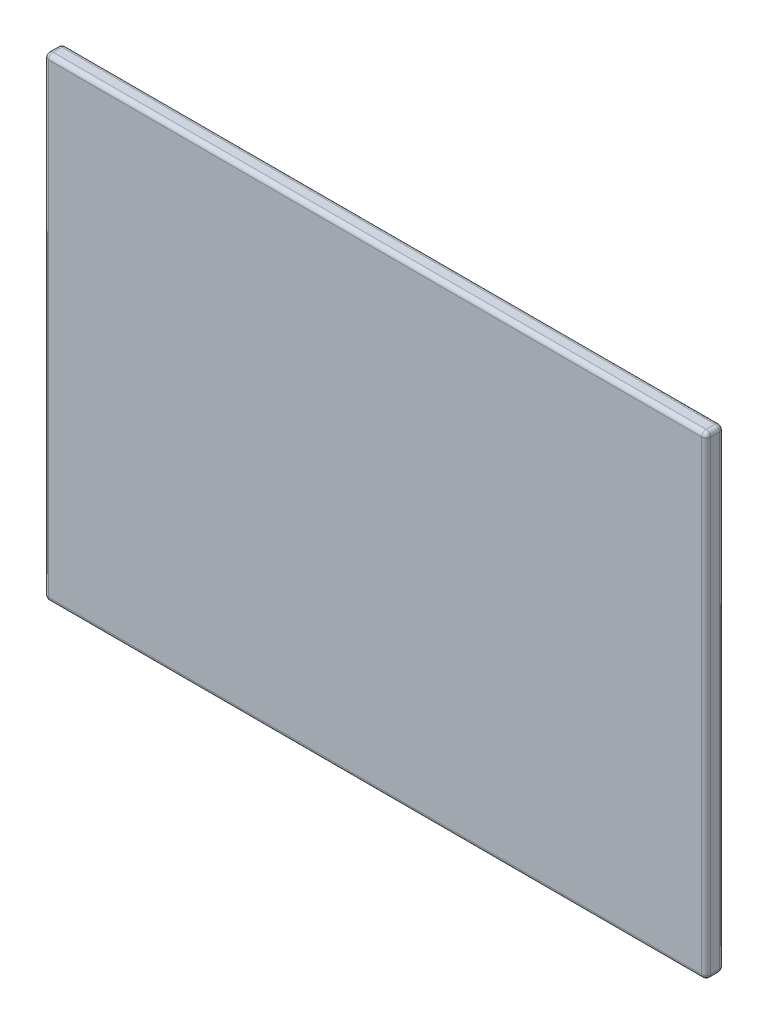
ISO-10303-21;
HEADER;
FILE_DESCRIPTION(('STEP AP214'),'2;1');
FILE_NAME('part.step','',(''),(''),'','','');
FILE_SCHEMA(('AUTOMOTIVE_DESIGN { 1 0 10303 214 1 1 1 1 }'));
ENDSEC;
DATA;
#1=APPLICATION_CONTEXT('core data for automotive mechanical design processes');
#2=APPLICATION_PROTOCOL_DEFINITION('international standard','automotive_design',2000,#1);
#3=PRODUCT_CONTEXT('',#1,'mechanical');
#4=PRODUCT('Part','Part','',(#3));
#5=PRODUCT_RELATED_PRODUCT_CATEGORY('part','',(#4));
#6=PRODUCT_DEFINITION_FORMATION('','',#4);
#7=PRODUCT_DEFINITION_CONTEXT('part definition',#1,'design');
#8=PRODUCT_DEFINITION('design','',#6,#7);
#9=PRODUCT_DEFINITION_SHAPE('','',#8);
#10=(LENGTH_UNIT() NAMED_UNIT(*) SI_UNIT(.MILLI.,.METRE.));
#11=(NAMED_UNIT(*) PLANE_ANGLE_UNIT() SI_UNIT($,.RADIAN.));
#12=(NAMED_UNIT(*) SI_UNIT($,.STERADIAN.) SOLID_ANGLE_UNIT());
#13=UNCERTAINTY_MEASURE_WITH_UNIT(LENGTH_MEASURE(1.E-05),#10,'distance_accuracy_value','');
#14=(GEOMETRIC_REPRESENTATION_CONTEXT(3) GLOBAL_UNCERTAINTY_ASSIGNED_CONTEXT((#13)) GLOBAL_UNIT_ASSIGNED_CONTEXT((#10,
#11,#12)) REPRESENTATION_CONTEXT('',''));
#15=CARTESIAN_POINT('',(0.,0.,0.));
#16=DIRECTION('',(0.,0.,1.));
#17=DIRECTION('',(1.,0.,0.));
#18=AXIS2_PLACEMENT_3D('',#15,#16,#17);
#19=CARTESIAN_POINT('',(37.35,-26.75,2.));
#20=DIRECTION('',(-1.,0.,0.));
#21=DIRECTION('',(0.,0.,1.));
#22=AXIS2_PLACEMENT_3D('',#19,#20,#21);
#23=PLANE('',#22);
#24=DIRECTION('',(0.,1.,0.));
#25=VECTOR('',#24,1.);
#26=CARTESIAN_POINT('',(37.35,-26.75,1.5));
#27=LINE('',#26,#25);
#28=CARTESIAN_POINT('',(37.35,26.25,1.5));
#29=VERTEX_POINT('',#28);
#30=CARTESIAN_POINT('',(37.35,-26.25,1.5));
#31=VERTEX_POINT('',#30);
#32=EDGE_CURVE('E42',#29,#31,#27,.F.);
#33=ORIENTED_EDGE('',*,*,#32,.T.);
#34=DIRECTION('',(0.,0.,-1.));
#35=VECTOR('',#34,1.);
#36=CARTESIAN_POINT('',(37.35,-26.25,2.));
#37=LINE('',#36,#35);
#38=CARTESIAN_POINT('',(37.35,-26.25,0.5));
#39=VERTEX_POINT('',#38);
#40=EDGE_CURVE('E11',#31,#39,#37,.T.);
#41=ORIENTED_EDGE('',*,*,#40,.T.);
#42=DIRECTION('',(0.,1.,0.));
#43=VECTOR('',#42,1.);
#44=CARTESIAN_POINT('',(37.35,26.75,0.5));
#45=LINE('',#44,#43);
#46=CARTESIAN_POINT('',(37.35,26.25,0.5));
#47=VERTEX_POINT('',#46);
#48=EDGE_CURVE('E194',#39,#47,#45,.T.);
#49=ORIENTED_EDGE('',*,*,#48,.T.);
#50=DIRECTION('',(0.,0.,-1.));
#51=VECTOR('',#50,1.);
#52=CARTESIAN_POINT('',(37.35,26.25,2.));
#53=LINE('',#52,#51);
#54=EDGE_CURVE('E53',#47,#29,#53,.F.);
#55=ORIENTED_EDGE('',*,*,#54,.T.);
#56=EDGE_LOOP('',(#33,#41,#49,#55));
#57=FACE_BOUND('',#56,.T.);
#58=ADVANCED_FACE('F33',(#57),#23,.F.);
#59=CARTESIAN_POINT('',(-37.35,26.75,2.));
#60=DIRECTION('',(0.,-1.,0.));
#61=DIRECTION('',(0.,0.,-1.));
#62=AXIS2_PLACEMENT_3D('',#59,#60,#61);
#63=PLANE('',#62);
#64=DIRECTION('',(0.,0.,-1.));
#65=VECTOR('',#64,1.);
#66=CARTESIAN_POINT('',(-36.85,26.75,2.));
#67=LINE('',#66,#65);
#68=CARTESIAN_POINT('',(-36.85,26.75,0.5));
#69=VERTEX_POINT('',#68);
#70=CARTESIAN_POINT('',(-36.85,26.75,1.5));
#71=VERTEX_POINT('',#70);
#72=EDGE_CURVE('E189',#69,#71,#67,.F.);
#73=ORIENTED_EDGE('',*,*,#72,.T.);
#74=DIRECTION('',(-1.,0.,0.));
#75=VECTOR('',#74,1.);
#76=CARTESIAN_POINT('',(-37.35,26.75,1.5));
#77=LINE('',#76,#75);
#78=CARTESIAN_POINT('',(36.85,26.75,1.5));
#79=VERTEX_POINT('',#78);
#80=EDGE_CURVE('E191',#71,#79,#77,.F.);
#81=ORIENTED_EDGE('',*,*,#80,.T.);
#82=DIRECTION('',(0.,0.,-1.));
#83=VECTOR('',#82,1.);
#84=CARTESIAN_POINT('',(36.85,26.75,2.));
#85=LINE('',#84,#83);
#86=CARTESIAN_POINT('',(36.85,26.75,0.5));
#87=VERTEX_POINT('',#86);
#88=EDGE_CURVE('E185',#79,#87,#85,.T.);
#89=ORIENTED_EDGE('',*,*,#88,.T.);
#90=DIRECTION('',(-1.,0.,0.));
#91=VECTOR('',#90,1.);
#92=CARTESIAN_POINT('',(-37.35,26.75,0.5));
#93=LINE('',#92,#91);
#94=EDGE_CURVE('E187',#87,#69,#93,.T.);
#95=ORIENTED_EDGE('',*,*,#94,.T.);
#96=EDGE_LOOP('',(#73,#81,#89,#95));
#97=FACE_BOUND('',#96,.T.);
#98=ADVANCED_FACE('F278',(#97),#63,.F.);
#99=CARTESIAN_POINT('',(-37.35,-26.75,2.));
#100=DIRECTION('',(1.,0.,0.));
#101=DIRECTION('',(0.,0.,-1.));
#102=AXIS2_PLACEMENT_3D('',#99,#100,#101);
#103=PLANE('',#102);
#104=DIRECTION('',(0.,0.,-1.));
#105=VECTOR('',#104,1.);
#106=CARTESIAN_POINT('',(-37.35,-26.25,2.));
#107=LINE('',#106,#105);
#108=CARTESIAN_POINT('',(-37.35,-26.25,0.5));
#109=VERTEX_POINT('',#108);
#110=CARTESIAN_POINT('',(-37.35,-26.25,1.5));
#111=VERTEX_POINT('',#110);
#112=EDGE_CURVE('E180',#109,#111,#107,.F.);
#113=ORIENTED_EDGE('',*,*,#112,.T.);
#114=DIRECTION('',(0.,-1.,0.));
#115=VECTOR('',#114,1.);
#116=CARTESIAN_POINT('',(-37.35,-26.75,1.5));
#117=LINE('',#116,#115);
#118=CARTESIAN_POINT('',(-37.35,26.25,1.5));
#119=VERTEX_POINT('',#118);
#120=EDGE_CURVE('E182',#111,#119,#117,.F.);
#121=ORIENTED_EDGE('',*,*,#120,.T.);
#122=DIRECTION('',(0.,0.,-1.));
#123=VECTOR('',#122,1.);
#124=CARTESIAN_POINT('',(-37.35,26.25,2.));
#125=LINE('',#124,#123);
#126=CARTESIAN_POINT('',(-37.35,26.25,0.5));
#127=VERTEX_POINT('',#126);
#128=EDGE_CURVE('E176',#119,#127,#125,.T.);
#129=ORIENTED_EDGE('',*,*,#128,.T.);
#130=DIRECTION('',(0.,-1.,0.));
#131=VECTOR('',#130,1.);
#132=CARTESIAN_POINT('',(-37.35,-26.75,0.5));
#133=LINE('',#132,#131);
#134=EDGE_CURVE('E178',#127,#109,#133,.T.);
#135=ORIENTED_EDGE('',*,*,#134,.T.);
#136=EDGE_LOOP('',(#113,#121,#129,#135));
#137=FACE_BOUND('',#136,.T.);
#138=ADVANCED_FACE('F269',(#137),#103,.F.);
#139=CARTESIAN_POINT('',(-37.35,-26.75,2.));
#140=DIRECTION('',(0.,1.,0.));
#141=DIRECTION('',(0.,0.,1.));
#142=AXIS2_PLACEMENT_3D('',#139,#140,#141);
#143=PLANE('',#142);
#144=DIRECTION('',(1.,0.,0.));
#145=VECTOR('',#144,1.);
#146=CARTESIAN_POINT('',(-37.35,-26.75,1.5));
#147=LINE('',#146,#145);
#148=CARTESIAN_POINT('',(36.85,-26.75,1.5));
#149=VERTEX_POINT('',#148);
#150=CARTESIAN_POINT('',(-36.85,-26.75,1.5));
#151=VERTEX_POINT('',#150);
#152=EDGE_CURVE('E129',#149,#151,#147,.F.);
#153=ORIENTED_EDGE('',*,*,#152,.T.);
#154=DIRECTION('',(0.,0.,-1.));
#155=VECTOR('',#154,1.);
#156=CARTESIAN_POINT('',(-36.85,-26.75,2.));
#157=LINE('',#156,#155);
#158=CARTESIAN_POINT('',(-36.85,-26.75,0.5));
#159=VERTEX_POINT('',#158);
#160=EDGE_CURVE('E165',#151,#159,#157,.T.);
#161=ORIENTED_EDGE('',*,*,#160,.T.);
#162=DIRECTION('',(1.,0.,0.));
#163=VECTOR('',#162,1.);
#164=CARTESIAN_POINT('',(37.35,-26.75,0.5));
#165=LINE('',#164,#163);
#166=CARTESIAN_POINT('',(36.85,-26.75,0.5));
#167=VERTEX_POINT('',#166);
#168=EDGE_CURVE('E158',#159,#167,#165,.T.);
#169=ORIENTED_EDGE('',*,*,#168,.T.);
#170=DIRECTION('',(0.,0.,-1.));
#171=VECTOR('',#170,1.);
#172=CARTESIAN_POINT('',(36.85,-26.75,2.));
#173=LINE('',#172,#171);
#174=EDGE_CURVE('E156',#167,#149,#173,.F.);
#175=ORIENTED_EDGE('',*,*,#174,.T.);
#176=EDGE_LOOP('',(#153,#161,#169,#175));
#177=FACE_BOUND('',#176,.T.);
#178=ADVANCED_FACE('F356',(#177),#143,.F.);
#179=CARTESIAN_POINT('',(0.,0.,2.));
#180=DIRECTION('',(0.,0.,-1.));
#181=DIRECTION('',(-1.,0.,0.));
#182=AXIS2_PLACEMENT_3D('',#179,#180,#181);
#183=PLANE('',#182);
#184=DIRECTION('',(0.,-1.,0.));
#185=VECTOR('',#184,1.);
#186=CARTESIAN_POINT('',(-36.85,0.,2.));
#187=LINE('',#186,#185);
#188=CARTESIAN_POINT('',(-36.85,26.25,2.));
#189=VERTEX_POINT('',#188);
#190=CARTESIAN_POINT('',(-36.85,-26.25,2.));
#191=VERTEX_POINT('',#190);
#192=EDGE_CURVE('E154',#189,#191,#187,.T.);
#193=ORIENTED_EDGE('',*,*,#192,.T.);
#194=DIRECTION('',(1.,0.,0.));
#195=VECTOR('',#194,1.);
#196=CARTESIAN_POINT('',(0.,-26.25,2.));
#197=LINE('',#196,#195);
#198=CARTESIAN_POINT('',(36.85,-26.25,2.));
#199=VERTEX_POINT('',#198);
#200=EDGE_CURVE('E127',#191,#199,#197,.T.);
#201=ORIENTED_EDGE('',*,*,#200,.T.);
#202=DIRECTION('',(0.,1.,0.));
#203=VECTOR('',#202,1.);
#204=CARTESIAN_POINT('',(36.85,0.,2.));
#205=LINE('',#204,#203);
#206=CARTESIAN_POINT('',(36.85,26.25,2.));
#207=VERTEX_POINT('',#206);
#208=EDGE_CURVE('E144',#199,#207,#205,.T.);
#209=ORIENTED_EDGE('',*,*,#208,.T.);
#210=DIRECTION('',(-1.,0.,0.));
#211=VECTOR('',#210,1.);
#212=CARTESIAN_POINT('',(0.,26.25,2.));
#213=LINE('',#212,#211);
#214=EDGE_CURVE('E150',#207,#189,#213,.T.);
#215=ORIENTED_EDGE('',*,*,#214,.T.);
#216=EDGE_LOOP('',(#193,#201,#209,#215));
#217=FACE_BOUND('',#216,.T.);
#218=ADVANCED_FACE('F152',(#217),#183,.F.);
#219=CARTESIAN_POINT('',(0.,0.,0.));
#220=DIRECTION('',(0.,0.,-1.));
#221=DIRECTION('',(-1.,0.,0.));
#222=AXIS2_PLACEMENT_3D('',#219,#220,#221);
#223=PLANE('',#222);
#224=DIRECTION('',(0.,1.,0.));
#225=VECTOR('',#224,1.);
#226=CARTESIAN_POINT('',(36.85,-26.75,0.));
#227=LINE('',#226,#225);
#228=CARTESIAN_POINT('',(36.85,26.25,0.));
#229=VERTEX_POINT('',#228);
#230=CARTESIAN_POINT('',(36.85,-26.25,0.));
#231=VERTEX_POINT('',#230);
#232=EDGE_CURVE('E167',#229,#231,#227,.F.);
#233=ORIENTED_EDGE('',*,*,#232,.T.);
#234=DIRECTION('',(1.,0.,0.));
#235=VECTOR('',#234,1.);
#236=CARTESIAN_POINT('',(-37.35,-26.25,0.));
#237=LINE('',#236,#235);
#238=CARTESIAN_POINT('',(-36.85,-26.25,0.));
#239=VERTEX_POINT('',#238);
#240=EDGE_CURVE('E173',#231,#239,#237,.F.);
#241=ORIENTED_EDGE('',*,*,#240,.T.);
#242=DIRECTION('',(0.,-1.,0.));
#243=VECTOR('',#242,1.);
#244=CARTESIAN_POINT('',(-36.85,26.75,0.));
#245=LINE('',#244,#243);
#246=CARTESIAN_POINT('',(-36.85,26.25,0.));
#247=VERTEX_POINT('',#246);
#248=EDGE_CURVE('E171',#239,#247,#245,.F.);
#249=ORIENTED_EDGE('',*,*,#248,.T.);
#250=DIRECTION('',(-1.,0.,0.));
#251=VECTOR('',#250,1.);
#252=CARTESIAN_POINT('',(37.35,26.25,0.));
#253=LINE('',#252,#251);
#254=EDGE_CURVE('E169',#247,#229,#253,.F.);
#255=ORIENTED_EDGE('',*,*,#254,.T.);
#256=EDGE_LOOP('',(#233,#241,#249,#255));
#257=FACE_BOUND('',#256,.T.);
#258=ADVANCED_FACE('F296',(#257),#223,.T.);
#259=CARTESIAN_POINT('',(-37.35,26.25,0.5));
#260=DIRECTION('',(1.,0.,0.));
#261=DIRECTION('',(0.,0.,-1.));
#262=AXIS2_PLACEMENT_3D('',#259,#260,#261);
#263=CYLINDRICAL_SURFACE('',#262,0.5);
#264=CARTESIAN_POINT('',(-36.85,26.25,0.5));
#265=DIRECTION('',(-1.,0.,0.));
#266=DIRECTION('',(0.,0.,1.));
#267=AXIS2_PLACEMENT_3D('',#264,#265,#266);
#268=CIRCLE('',#267,0.5);
#269=EDGE_CURVE('E37',#69,#247,#268,.T.);
#270=ORIENTED_EDGE('',*,*,#269,.F.);
#271=ORIENTED_EDGE('',*,*,#94,.F.);
#272=CARTESIAN_POINT('',(36.85,26.25,0.5));
#273=DIRECTION('',(1.,0.,0.));
#274=DIRECTION('',(0.,0.,-1.));
#275=AXIS2_PLACEMENT_3D('',#272,#273,#274);
#276=CIRCLE('',#275,0.5);
#277=EDGE_CURVE('E246',#229,#87,#276,.T.);
#278=ORIENTED_EDGE('',*,*,#277,.F.);
#279=ORIENTED_EDGE('',*,*,#254,.F.);
#280=EDGE_LOOP('',(#270,#271,#278,#279));
#281=FACE_BOUND('',#280,.T.);
#282=ADVANCED_FACE('F35',(#281),#263,.T.);
#283=CARTESIAN_POINT('',(-36.85,26.25,0.5));
#284=DIRECTION('',(0.,0.,1.));
#285=DIRECTION('',(1.,0.,0.));
#286=AXIS2_PLACEMENT_3D('',#283,#284,#285);
#287=SPHERICAL_SURFACE('',#286,0.5);
#288=CARTESIAN_POINT('',(-36.85,26.25,0.5));
#289=DIRECTION('',(0.,0.,-1.));
#290=DIRECTION('',(-1.,0.,0.));
#291=AXIS2_PLACEMENT_3D('',#288,#289,#290);
#292=CIRCLE('',#291,0.5);
#293=EDGE_CURVE('E241',#69,#127,#292,.F.);
#294=ORIENTED_EDGE('',*,*,#293,.F.);
#295=ORIENTED_EDGE('',*,*,#269,.T.);
#296=CARTESIAN_POINT('',(-36.85,26.25,0.5));
#297=DIRECTION('',(0.,1.,0.));
#298=DIRECTION('',(0.,0.,1.));
#299=AXIS2_PLACEMENT_3D('',#296,#297,#298);
#300=CIRCLE('',#299,0.5);
#301=EDGE_CURVE('E244',#127,#247,#300,.F.);
#302=ORIENTED_EDGE('',*,*,#301,.F.);
#303=EDGE_LOOP('',(#294,#295,#302));
#304=FACE_BOUND('',#303,.T.);
#305=ADVANCED_FACE('F257',(#304),#287,.T.);
#306=CARTESIAN_POINT('',(36.85,26.25,0.5));
#307=DIRECTION('',(0.,0.,1.));
#308=DIRECTION('',(1.,0.,0.));
#309=AXIS2_PLACEMENT_3D('',#306,#307,#308);
#310=SPHERICAL_SURFACE('',#309,0.5);
#311=CARTESIAN_POINT('',(36.85,26.25,0.5));
#312=DIRECTION('',(0.,1.,0.));
#313=DIRECTION('',(0.,0.,1.));
#314=AXIS2_PLACEMENT_3D('',#311,#312,#313);
#315=CIRCLE('',#314,0.5);
#316=EDGE_CURVE('E235',#229,#47,#315,.F.);
#317=ORIENTED_EDGE('',*,*,#316,.F.);
#318=ORIENTED_EDGE('',*,*,#277,.T.);
#319=CARTESIAN_POINT('',(36.85,26.25,0.5));
#320=DIRECTION('',(0.,0.,-1.));
#321=DIRECTION('',(-1.,0.,0.));
#322=AXIS2_PLACEMENT_3D('',#319,#320,#321);
#323=CIRCLE('',#322,0.5);
#324=EDGE_CURVE('E238',#47,#87,#323,.F.);
#325=ORIENTED_EDGE('',*,*,#324,.F.);
#326=EDGE_LOOP('',(#317,#318,#325));
#327=FACE_BOUND('',#326,.T.);
#328=ADVANCED_FACE('F289',(#327),#310,.T.);
#329=CARTESIAN_POINT('',(-36.85,-26.75,0.5));
#330=DIRECTION('',(0.,1.,0.));
#331=DIRECTION('',(0.,0.,1.));
#332=AXIS2_PLACEMENT_3D('',#329,#330,#331);
#333=CYLINDRICAL_SURFACE('',#332,0.5);
#334=ORIENTED_EDGE('',*,*,#301,.T.);
#335=ORIENTED_EDGE('',*,*,#248,.F.);
#336=CARTESIAN_POINT('',(-36.85,-26.25,0.5));
#337=DIRECTION('',(0.,-1.,0.));
#338=DIRECTION('',(0.,0.,-1.));
#339=AXIS2_PLACEMENT_3D('',#336,#337,#338);
#340=CIRCLE('',#339,0.5);
#341=EDGE_CURVE('E230',#109,#239,#340,.T.);
#342=ORIENTED_EDGE('',*,*,#341,.F.);
#343=ORIENTED_EDGE('',*,*,#134,.F.);
#344=EDGE_LOOP('',(#334,#335,#342,#343));
#345=FACE_BOUND('',#344,.T.);
#346=ADVANCED_FACE('F265',(#345),#333,.T.);
#347=CARTESIAN_POINT('',(-36.85,26.25,2.));
#348=DIRECTION('',(0.,0.,-1.));
#349=DIRECTION('',(-1.,0.,0.));
#350=AXIS2_PLACEMENT_3D('',#347,#348,#349);
#351=CYLINDRICAL_SURFACE('',#350,0.5);
#352=ORIENTED_EDGE('',*,*,#293,.T.);
#353=ORIENTED_EDGE('',*,*,#128,.F.);
#354=CARTESIAN_POINT('',(-36.85,26.25,1.5));
#355=DIRECTION('',(0.,0.,1.));
#356=DIRECTION('',(1.,0.,0.));
#357=AXIS2_PLACEMENT_3D('',#354,#355,#356);
#358=CIRCLE('',#357,0.5);
#359=EDGE_CURVE('E227',#71,#119,#358,.T.);
#360=ORIENTED_EDGE('',*,*,#359,.F.);
#361=ORIENTED_EDGE('',*,*,#72,.F.);
#362=EDGE_LOOP('',(#352,#353,#360,#361));
#363=FACE_BOUND('',#362,.T.);
#364=ADVANCED_FACE('F275',(#363),#351,.T.);
#365=CARTESIAN_POINT('',(0.,26.25,1.5));
#366=DIRECTION('',(-1.,0.,0.));
#367=DIRECTION('',(0.,0.,1.));
#368=AXIS2_PLACEMENT_3D('',#365,#366,#367);
#369=CYLINDRICAL_SURFACE('',#368,0.5);
#370=CARTESIAN_POINT('',(36.85,26.25,1.5));
#371=DIRECTION('',(1.,0.,0.));
#372=DIRECTION('',(0.,0.,-1.));
#373=AXIS2_PLACEMENT_3D('',#370,#371,#372);
#374=CIRCLE('',#373,0.5);
#375=EDGE_CURVE('E221',#79,#207,#374,.T.);
#376=ORIENTED_EDGE('',*,*,#375,.F.);
#377=ORIENTED_EDGE('',*,*,#80,.F.);
#378=CARTESIAN_POINT('',(-36.85,26.25,1.5));
#379=DIRECTION('',(-1.,0.,0.));
#380=DIRECTION('',(0.,0.,1.));
#381=AXIS2_PLACEMENT_3D('',#378,#379,#380);
#382=CIRCLE('',#381,0.5);
#383=EDGE_CURVE('E224',#189,#71,#382,.T.);
#384=ORIENTED_EDGE('',*,*,#383,.F.);
#385=ORIENTED_EDGE('',*,*,#214,.F.);
#386=EDGE_LOOP('',(#376,#377,#384,#385));
#387=FACE_BOUND('',#386,.T.);
#388=ADVANCED_FACE('F282',(#387),#369,.T.);
#389=CARTESIAN_POINT('',(36.85,26.25,2.));
#390=DIRECTION('',(0.,0.,-1.));
#391=DIRECTION('',(-1.,0.,0.));
#392=AXIS2_PLACEMENT_3D('',#389,#390,#391);
#393=CYLINDRICAL_SURFACE('',#392,0.5);
#394=ORIENTED_EDGE('',*,*,#324,.T.);
#395=ORIENTED_EDGE('',*,*,#88,.F.);
#396=CARTESIAN_POINT('',(36.85,26.25,1.5));
#397=DIRECTION('',(0.,0.,1.));
#398=DIRECTION('',(1.,0.,0.));
#399=AXIS2_PLACEMENT_3D('',#396,#397,#398);
#400=CIRCLE('',#399,0.5);
#401=EDGE_CURVE('E219',#29,#79,#400,.T.);
#402=ORIENTED_EDGE('',*,*,#401,.F.);
#403=ORIENTED_EDGE('',*,*,#54,.F.);
#404=EDGE_LOOP('',(#394,#395,#402,#403));
#405=FACE_BOUND('',#404,.T.);
#406=ADVANCED_FACE('F287',(#405),#393,.T.);
#407=CARTESIAN_POINT('',(36.85,-26.75,0.5));
#408=DIRECTION('',(0.,-1.,0.));
#409=DIRECTION('',(0.,0.,-1.));
#410=AXIS2_PLACEMENT_3D('',#407,#408,#409);
#411=CYLINDRICAL_SURFACE('',#410,0.5);
#412=ORIENTED_EDGE('',*,*,#316,.T.);
#413=ORIENTED_EDGE('',*,*,#48,.F.);
#414=CARTESIAN_POINT('',(36.85,-26.25,0.5));
#415=DIRECTION('',(0.,-1.,0.));
#416=DIRECTION('',(0.,0.,-1.));
#417=AXIS2_PLACEMENT_3D('',#414,#415,#416);
#418=CIRCLE('',#417,0.5);
#419=EDGE_CURVE('E216',#231,#39,#418,.T.);
#420=ORIENTED_EDGE('',*,*,#419,.F.);
#421=ORIENTED_EDGE('',*,*,#232,.F.);
#422=EDGE_LOOP('',(#412,#413,#420,#421));
#423=FACE_BOUND('',#422,.T.);
#424=ADVANCED_FACE('F293',(#423),#411,.T.);
#425=CARTESIAN_POINT('',(-37.35,-26.25,0.5));
#426=DIRECTION('',(-1.,0.,0.));
#427=DIRECTION('',(0.,0.,1.));
#428=AXIS2_PLACEMENT_3D('',#425,#426,#427);
#429=CYLINDRICAL_SURFACE('',#428,0.5);
#430=CARTESIAN_POINT('',(-36.85,-26.25,0.5));
#431=DIRECTION('',(-1.,0.,0.));
#432=DIRECTION('',(0.,0.,1.));
#433=AXIS2_PLACEMENT_3D('',#430,#431,#432);
#434=CIRCLE('',#433,0.5);
#435=EDGE_CURVE('E232',#239,#159,#434,.T.);
#436=ORIENTED_EDGE('',*,*,#435,.F.);
#437=ORIENTED_EDGE('',*,*,#240,.F.);
#438=CARTESIAN_POINT('',(36.85,-26.25,0.5));
#439=DIRECTION('',(1.,0.,0.));
#440=DIRECTION('',(0.,0.,-1.));
#441=AXIS2_PLACEMENT_3D('',#438,#439,#440);
#442=CIRCLE('',#441,0.5);
#443=EDGE_CURVE('E213',#167,#231,#442,.T.);
#444=ORIENTED_EDGE('',*,*,#443,.F.);
#445=ORIENTED_EDGE('',*,*,#168,.F.);
#446=EDGE_LOOP('',(#436,#437,#444,#445));
#447=FACE_BOUND('',#446,.T.);
#448=ADVANCED_FACE('F300',(#447),#429,.T.);
#449=CARTESIAN_POINT('',(-36.85,-26.25,0.5));
#450=DIRECTION('',(0.,0.,1.));
#451=DIRECTION('',(1.,0.,0.));
#452=AXIS2_PLACEMENT_3D('',#449,#450,#451);
#453=SPHERICAL_SURFACE('',#452,0.5);
#454=ORIENTED_EDGE('',*,*,#341,.T.);
#455=ORIENTED_EDGE('',*,*,#435,.T.);
#456=CARTESIAN_POINT('',(-36.85,-26.25,0.5));
#457=DIRECTION('',(0.,0.,-1.));
#458=DIRECTION('',(-1.,0.,0.));
#459=AXIS2_PLACEMENT_3D('',#456,#457,#458);
#460=CIRCLE('',#459,0.5);
#461=EDGE_CURVE('E210',#109,#159,#460,.F.);
#462=ORIENTED_EDGE('',*,*,#461,.F.);
#463=EDGE_LOOP('',(#454,#455,#462));
#464=FACE_BOUND('',#463,.T.);
#465=ADVANCED_FACE('F304',(#464),#453,.T.);
#466=CARTESIAN_POINT('',(-36.85,26.25,1.5));
#467=DIRECTION('',(0.,0.,1.));
#468=DIRECTION('',(1.,0.,0.));
#469=AXIS2_PLACEMENT_3D('',#466,#467,#468);
#470=SPHERICAL_SURFACE('',#469,0.5);
#471=ORIENTED_EDGE('',*,*,#383,.T.);
#472=ORIENTED_EDGE('',*,*,#359,.T.);
#473=CARTESIAN_POINT('',(-36.85,26.25,1.5));
#474=DIRECTION('',(0.,1.,0.));
#475=DIRECTION('',(0.,0.,1.));
#476=AXIS2_PLACEMENT_3D('',#473,#474,#475);
#477=CIRCLE('',#476,0.5);
#478=EDGE_CURVE('E208',#189,#119,#477,.F.);
#479=ORIENTED_EDGE('',*,*,#478,.F.);
#480=EDGE_LOOP('',(#471,#472,#479));
#481=FACE_BOUND('',#480,.T.);
#482=ADVANCED_FACE('F315',(#481),#470,.T.);
#483=CARTESIAN_POINT('',(36.85,26.25,1.5));
#484=DIRECTION('',(0.,0.,1.));
#485=DIRECTION('',(1.,0.,0.));
#486=AXIS2_PLACEMENT_3D('',#483,#484,#485);
#487=SPHERICAL_SURFACE('',#486,0.5);
#488=ORIENTED_EDGE('',*,*,#401,.T.);
#489=ORIENTED_EDGE('',*,*,#375,.T.);
#490=CARTESIAN_POINT('',(36.85,26.25,1.5));
#491=DIRECTION('',(0.,1.,0.));
#492=DIRECTION('',(0.,0.,1.));
#493=AXIS2_PLACEMENT_3D('',#490,#491,#492);
#494=CIRCLE('',#493,0.5);
#495=EDGE_CURVE('E147',#29,#207,#494,.F.);
#496=ORIENTED_EDGE('',*,*,#495,.F.);
#497=EDGE_LOOP('',(#488,#489,#496));
#498=FACE_BOUND('',#497,.T.);
#499=ADVANCED_FACE('F317',(#498),#487,.T.);
#500=CARTESIAN_POINT('',(36.85,-26.25,0.5));
#501=DIRECTION('',(0.,0.,1.));
#502=DIRECTION('',(1.,0.,0.));
#503=AXIS2_PLACEMENT_3D('',#500,#501,#502);
#504=SPHERICAL_SURFACE('',#503,0.5);
#505=ORIENTED_EDGE('',*,*,#443,.T.);
#506=ORIENTED_EDGE('',*,*,#419,.T.);
#507=CARTESIAN_POINT('',(36.85,-26.25,0.5));
#508=DIRECTION('',(0.,0.,-1.));
#509=DIRECTION('',(-1.,0.,0.));
#510=AXIS2_PLACEMENT_3D('',#507,#508,#509);
#511=CIRCLE('',#510,0.5);
#512=EDGE_CURVE('E205',#167,#39,#511,.F.);
#513=ORIENTED_EDGE('',*,*,#512,.F.);
#514=EDGE_LOOP('',(#505,#506,#513));
#515=FACE_BOUND('',#514,.T.);
#516=ADVANCED_FACE('F323',(#515),#504,.T.);
#517=CARTESIAN_POINT('',(-36.85,-26.25,2.));
#518=DIRECTION('',(0.,0.,-1.));
#519=DIRECTION('',(-1.,0.,0.));
#520=AXIS2_PLACEMENT_3D('',#517,#518,#519);
#521=CYLINDRICAL_SURFACE('',#520,0.5);
#522=ORIENTED_EDGE('',*,*,#461,.T.);
#523=ORIENTED_EDGE('',*,*,#160,.F.);
#524=CARTESIAN_POINT('',(-36.85,-26.25,1.5));
#525=DIRECTION('',(0.,0.,1.));
#526=DIRECTION('',(1.,0.,0.));
#527=AXIS2_PLACEMENT_3D('',#524,#525,#526);
#528=CIRCLE('',#527,0.5);
#529=EDGE_CURVE('E202',#111,#151,#528,.T.);
#530=ORIENTED_EDGE('',*,*,#529,.F.);
#531=ORIENTED_EDGE('',*,*,#112,.F.);
#532=EDGE_LOOP('',(#522,#523,#530,#531));
#533=FACE_BOUND('',#532,.T.);
#534=ADVANCED_FACE('F307',(#533),#521,.T.);
#535=CARTESIAN_POINT('',(-36.85,0.,1.5));
#536=DIRECTION('',(0.,-1.,0.));
#537=DIRECTION('',(0.,0.,-1.));
#538=AXIS2_PLACEMENT_3D('',#535,#536,#537);
#539=CYLINDRICAL_SURFACE('',#538,0.5);
#540=ORIENTED_EDGE('',*,*,#478,.T.);
#541=ORIENTED_EDGE('',*,*,#120,.F.);
#542=CARTESIAN_POINT('',(-36.85,-26.25,1.5));
#543=DIRECTION('',(0.,-1.,0.));
#544=DIRECTION('',(0.,0.,-1.));
#545=AXIS2_PLACEMENT_3D('',#542,#543,#544);
#546=CIRCLE('',#545,0.5);
#547=EDGE_CURVE('E141',#191,#111,#546,.T.);
#548=ORIENTED_EDGE('',*,*,#547,.F.);
#549=ORIENTED_EDGE('',*,*,#192,.F.);
#550=EDGE_LOOP('',(#540,#541,#548,#549));
#551=FACE_BOUND('',#550,.T.);
#552=ADVANCED_FACE('F313',(#551),#539,.T.);
#553=CARTESIAN_POINT('',(36.85,0.,1.5));
#554=DIRECTION('',(0.,1.,0.));
#555=DIRECTION('',(0.,0.,1.));
#556=AXIS2_PLACEMENT_3D('',#553,#554,#555);
#557=CYLINDRICAL_SURFACE('',#556,0.5);
#558=ORIENTED_EDGE('',*,*,#495,.T.);
#559=ORIENTED_EDGE('',*,*,#208,.F.);
#560=CARTESIAN_POINT('',(36.85,-26.25,1.5));
#561=DIRECTION('',(0.,-1.,0.));
#562=DIRECTION('',(0.,0.,-1.));
#563=AXIS2_PLACEMENT_3D('',#560,#561,#562);
#564=CIRCLE('',#563,0.5);
#565=EDGE_CURVE('E135',#31,#199,#564,.T.);
#566=ORIENTED_EDGE('',*,*,#565,.F.);
#567=ORIENTED_EDGE('',*,*,#32,.F.);
#568=EDGE_LOOP('',(#558,#559,#566,#567));
#569=FACE_BOUND('',#568,.T.);
#570=ADVANCED_FACE('F145',(#569),#557,.T.);
#571=CARTESIAN_POINT('',(36.85,-26.25,2.));
#572=DIRECTION('',(0.,0.,-1.));
#573=DIRECTION('',(-1.,0.,0.));
#574=AXIS2_PLACEMENT_3D('',#571,#572,#573);
#575=CYLINDRICAL_SURFACE('',#574,0.5);
#576=ORIENTED_EDGE('',*,*,#512,.T.);
#577=ORIENTED_EDGE('',*,*,#40,.F.);
#578=CARTESIAN_POINT('',(36.85,-26.25,1.5));
#579=DIRECTION('',(0.,0.,1.));
#580=DIRECTION('',(1.,0.,0.));
#581=AXIS2_PLACEMENT_3D('',#578,#579,#580);
#582=CIRCLE('',#581,0.5);
#583=EDGE_CURVE('E139',#149,#31,#582,.T.);
#584=ORIENTED_EDGE('',*,*,#583,.F.);
#585=ORIENTED_EDGE('',*,*,#174,.F.);
#586=EDGE_LOOP('',(#576,#577,#584,#585));
#587=FACE_BOUND('',#586,.T.);
#588=ADVANCED_FACE('F340',(#587),#575,.T.);
#589=CARTESIAN_POINT('',(-36.85,-26.25,1.5));
#590=DIRECTION('',(0.,0.,1.));
#591=DIRECTION('',(1.,0.,0.));
#592=AXIS2_PLACEMENT_3D('',#589,#590,#591);
#593=SPHERICAL_SURFACE('',#592,0.5);
#594=ORIENTED_EDGE('',*,*,#547,.T.);
#595=ORIENTED_EDGE('',*,*,#529,.T.);
#596=CARTESIAN_POINT('',(-36.85,-26.25,1.5));
#597=DIRECTION('',(-1.,0.,0.));
#598=DIRECTION('',(0.,0.,1.));
#599=AXIS2_PLACEMENT_3D('',#596,#597,#598);
#600=CIRCLE('',#599,0.5);
#601=EDGE_CURVE('E132',#191,#151,#600,.F.);
#602=ORIENTED_EDGE('',*,*,#601,.F.);
#603=EDGE_LOOP('',(#594,#595,#602));
#604=FACE_BOUND('',#603,.T.);
#605=ADVANCED_FACE('F311',(#604),#593,.T.);
#606=CARTESIAN_POINT('',(36.85,-26.25,1.5));
#607=DIRECTION('',(0.,0.,1.));
#608=DIRECTION('',(1.,0.,0.));
#609=AXIS2_PLACEMENT_3D('',#606,#607,#608);
#610=SPHERICAL_SURFACE('',#609,0.5);
#611=ORIENTED_EDGE('',*,*,#583,.T.);
#612=ORIENTED_EDGE('',*,*,#565,.T.);
#613=CARTESIAN_POINT('',(36.85,-26.25,1.5));
#614=DIRECTION('',(1.,0.,0.));
#615=DIRECTION('',(0.,0.,-1.));
#616=AXIS2_PLACEMENT_3D('',#613,#614,#615);
#617=CIRCLE('',#616,0.5);
#618=EDGE_CURVE('E123',#149,#199,#617,.F.);
#619=ORIENTED_EDGE('',*,*,#618,.F.);
#620=EDGE_LOOP('',(#611,#612,#619));
#621=FACE_BOUND('',#620,.T.);
#622=ADVANCED_FACE('F137',(#621),#610,.T.);
#623=CARTESIAN_POINT('',(0.,-26.25,1.5));
#624=DIRECTION('',(1.,0.,0.));
#625=DIRECTION('',(0.,0.,-1.));
#626=AXIS2_PLACEMENT_3D('',#623,#624,#625);
#627=CYLINDRICAL_SURFACE('',#626,0.5);
#628=ORIENTED_EDGE('',*,*,#601,.T.);
#629=ORIENTED_EDGE('',*,*,#152,.F.);
#630=ORIENTED_EDGE('',*,*,#618,.T.);
#631=ORIENTED_EDGE('',*,*,#200,.F.);
#632=EDGE_LOOP('',(#628,#629,#630,#631));
#633=FACE_BOUND('',#632,.T.);
#634=ADVANCED_FACE('F125',(#633),#627,.T.);
#635=CLOSED_SHELL('',(#58,#98,#138,#178,#218,#258,#282,#305,#328,#346,#364,#388,#406,#424,#448,
#465,#482,#499,#516,#534,#552,#570,#588,#605,#622,#634));
#636=MANIFOLD_SOLID_BREP('B2',#635);
#637=ADVANCED_BREP_SHAPE_REPRESENTATION('',(#18,#636),#14);
#638=SHAPE_DEFINITION_REPRESENTATION(#9,#637);
ENDSEC;
END-ISO-10303-21;
